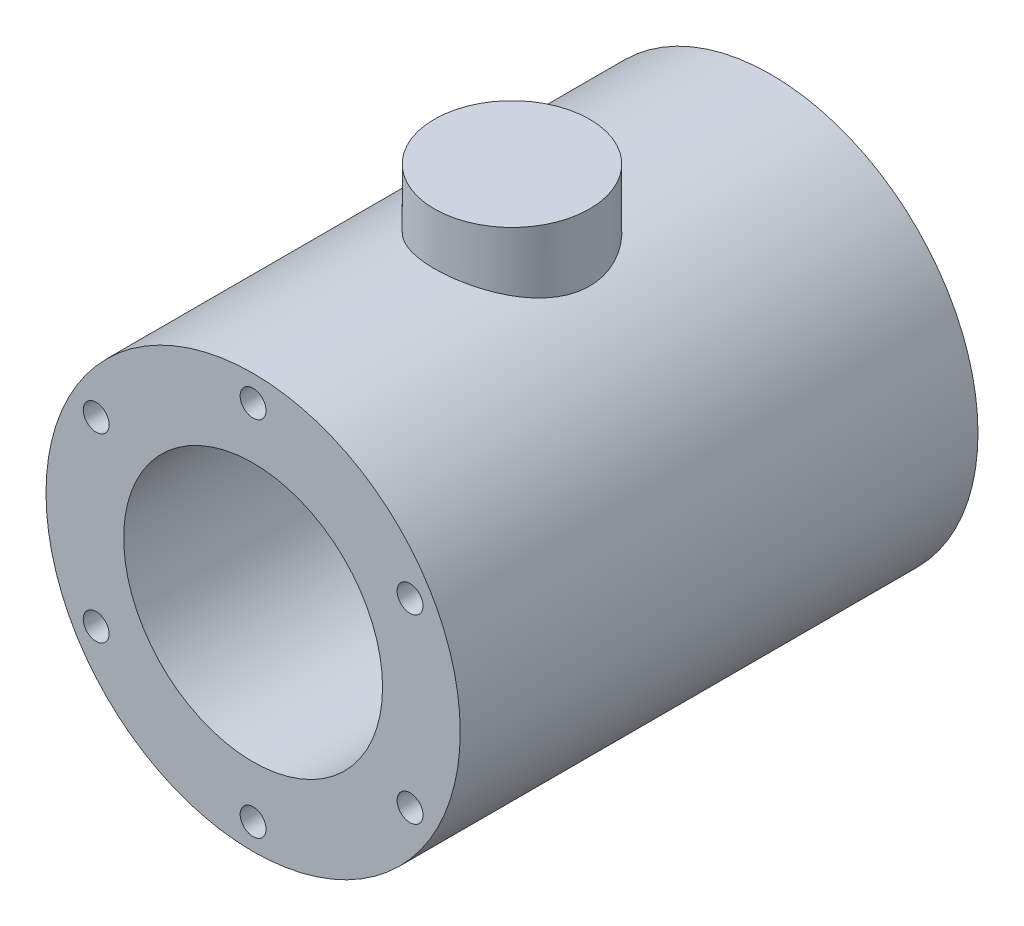
ISO-10303-21;
HEADER;
FILE_DESCRIPTION(('STEP AP214'),'2;1');
FILE_NAME('part.step','',(''),(''),'','','');
FILE_SCHEMA(('AUTOMOTIVE_DESIGN { 1 0 10303 214 1 1 1 1 }'));
ENDSEC;
DATA;
#1=APPLICATION_CONTEXT('core data for automotive mechanical design processes');
#2=APPLICATION_PROTOCOL_DEFINITION('international standard','automotive_design',2000,#1);
#3=PRODUCT_CONTEXT('',#1,'mechanical');
#4=PRODUCT('Part','Part','',(#3));
#5=PRODUCT_RELATED_PRODUCT_CATEGORY('part','',(#4));
#6=PRODUCT_DEFINITION_FORMATION('','',#4);
#7=PRODUCT_DEFINITION_CONTEXT('part definition',#1,'design');
#8=PRODUCT_DEFINITION('design','',#6,#7);
#9=PRODUCT_DEFINITION_SHAPE('','',#8);
#10=(LENGTH_UNIT() NAMED_UNIT(*) SI_UNIT(.MILLI.,.METRE.));
#11=(NAMED_UNIT(*) PLANE_ANGLE_UNIT() SI_UNIT($,.RADIAN.));
#12=(NAMED_UNIT(*) SI_UNIT($,.STERADIAN.) SOLID_ANGLE_UNIT());
#13=UNCERTAINTY_MEASURE_WITH_UNIT(LENGTH_MEASURE(1.E-05),#10,'distance_accuracy_value','');
#14=(GEOMETRIC_REPRESENTATION_CONTEXT(3) GLOBAL_UNCERTAINTY_ASSIGNED_CONTEXT((#13)) GLOBAL_UNIT_ASSIGNED_CONTEXT((#10,
#11,#12)) REPRESENTATION_CONTEXT('',''));
#15=CARTESIAN_POINT('',(0.,0.,0.));
#16=DIRECTION('',(0.,0.,1.));
#17=DIRECTION('',(1.,0.,0.));
#18=AXIS2_PLACEMENT_3D('',#15,#16,#17);
#19=CARTESIAN_POINT('',(0.,0.,100.));
#20=DIRECTION('',(0.,0.,-1.));
#21=DIRECTION('',(-1.,0.,0.));
#22=AXIS2_PLACEMENT_3D('',#19,#20,#21);
#23=CYLINDRICAL_SURFACE('',#22,40.);
#24=CARTESIAN_POINT('',(0.,0.,100.));
#25=DIRECTION('',(0.,0.,1.));
#26=DIRECTION('',(1.,0.,0.));
#27=AXIS2_PLACEMENT_3D('',#24,#25,#26);
#28=CIRCLE('',#27,40.);
#29=CARTESIAN_POINT('',(40.,0.,100.));
#30=VERTEX_POINT('',#29);
#31=EDGE_CURVE('E49',#30,#30,#28,.T.);
#32=ORIENTED_EDGE('',*,*,#31,.F.);
#33=EDGE_LOOP('',(#32));
#34=FACE_BOUND('',#33,.T.);
#35=CARTESIAN_POINT('',(0.,0.,0.));
#36=DIRECTION('',(0.,0.,1.));
#37=DIRECTION('',(1.,0.,0.));
#38=AXIS2_PLACEMENT_3D('',#35,#36,#37);
#39=CIRCLE('',#38,40.);
#40=CARTESIAN_POINT('',(40.,0.,0.));
#41=VERTEX_POINT('',#40);
#42=EDGE_CURVE('E54',#41,#41,#39,.T.);
#43=ORIENTED_EDGE('',*,*,#42,.T.);
#44=EDGE_LOOP('',(#43));
#45=FACE_BOUND('',#44,.T.);
#46=CARTESIAN_POINT('',(0.,40.,35.));
#47=CARTESIAN_POINT('',(-0.406155231941303,40.0000013887431,34.9999981078109));
#48=CARTESIAN_POINT('',(-0.812284348147754,39.9938006269278,35.0165087352432));
#49=CARTESIAN_POINT('',(-1.62147139095104,39.9691710100067,35.0823736768252));
#50=CARTESIAN_POINT('',(-2.02452957514366,39.950743192211,35.1317252048429));
#51=CARTESIAN_POINT('',(-2.82456330894158,39.9021609392328,35.262763514231));
#52=CARTESIAN_POINT('',(-3.22153975126587,39.8720082425855,35.3444455017548));
#53=CARTESIAN_POINT('',(-4.00666931290046,39.8007787911681,35.5393563651596));
#54=CARTESIAN_POINT('',(-4.39482219784621,39.759701746601,35.6525860779306));
#55=CARTESIAN_POINT('',(-5.15891467482712,39.6677879044666,35.9093037111225));
#56=CARTESIAN_POINT('',(-5.53487700582704,39.6169706650972,36.0527310509454));
#57=CARTESIAN_POINT('',(-6.27301569946845,39.5068163389401,36.3687688110822));
#58=CARTESIAN_POINT('',(-6.63519216809261,39.4474793176674,36.5413790069892));
#59=CARTESIAN_POINT('',(-7.34362780959021,39.3217570131001,36.914457942688));
#60=CARTESIAN_POINT('',(-7.6898863174579,39.2553714357202,37.1149278449718));
#61=CARTESIAN_POINT('',(-8.36464792699763,39.1171488135836,37.5423822776128));
#62=CARTESIAN_POINT('',(-8.69314455467263,39.0453098037457,37.769376381701));
#63=CARTESIAN_POINT('',(-9.34264058613321,38.8951200775698,38.2574993969521));
#64=CARTESIAN_POINT('',(-9.66287704281832,38.816625532978,38.5195995722186));
#65=CARTESIAN_POINT('',(-10.2803557268531,38.6576764432074,39.069075908794));
#66=CARTESIAN_POINT('',(-10.5775973290844,38.5772218448226,39.3564527567991));
#67=CARTESIAN_POINT('',(-11.1475099377515,38.4164124006621,39.9549099202484));
#68=CARTESIAN_POINT('',(-11.4201695058726,38.3360576183078,40.2660011472927));
#69=CARTESIAN_POINT('',(-11.9390379498077,38.1776498271183,40.909880624769));
#70=CARTESIAN_POINT('',(-12.1852557331364,38.0995960496066,41.2426615074592));
#71=CARTESIAN_POINT('',(-12.6586805831567,37.9449890154006,41.9413021187103));
#72=CARTESIAN_POINT('',(-12.8847959801516,37.8686081960777,42.3079410904324));
#73=CARTESIAN_POINT('',(-13.3051847550507,37.7229581925958,43.0604182261198));
#74=CARTESIAN_POINT('',(-13.4994571189537,37.6536892349313,43.4462570009689));
#75=CARTESIAN_POINT('',(-13.8544333470209,37.5245301930474,44.2344623219174));
#76=CARTESIAN_POINT('',(-14.015147681946,37.4646371848128,44.636823665621));
#77=CARTESIAN_POINT('',(-14.3015331739474,37.3562528480706,45.4553216064775));
#78=CARTESIAN_POINT('',(-14.4272063865916,37.3077608507878,45.8714573939968));
#79=CARTESIAN_POINT('',(-14.6377728200119,37.2256343859454,46.6970352812128));
#80=CARTESIAN_POINT('',(-14.7241266556605,37.1914723133209,47.1060523951637));
#81=CARTESIAN_POINT('',(-14.8624687487976,37.1364051781319,47.9307457779838));
#82=CARTESIAN_POINT('',(-14.914457888768,37.1154997751381,48.3464218755702));
#83=CARTESIAN_POINT('',(-14.9834733208266,37.0876922679378,49.180986486807));
#84=CARTESIAN_POINT('',(-15.00051204451,37.0807851846467,49.5998738050189));
#85=CARTESIAN_POINT('',(-14.9994645645736,37.0812091486228,50.4375889201603));
#86=CARTESIAN_POINT('',(-14.9813797233542,37.0885396436317,50.8564167187682));
#87=CARTESIAN_POINT('',(-14.9124348098487,37.1163110276097,51.6655821410388));
#88=CARTESIAN_POINT('',(-14.8636042471798,37.1359397477467,52.0561227078548));
#89=CARTESIAN_POINT('',(-14.7355873547809,37.1869225256987,52.8313977791823));
#90=CARTESIAN_POINT('',(-14.656402420588,37.2182760444665,53.2161325497691));
#91=CARTESIAN_POINT('',(-14.4684135891209,37.2917574570459,53.9772736256728));
#92=CARTESIAN_POINT('',(-14.3596065605833,37.3338864898767,54.3536790459679));
#93=CARTESIAN_POINT('',(-14.1133273980098,37.4276813895696,55.0957670642799));
#94=CARTESIAN_POINT('',(-13.9758543280917,37.4793475677919,55.4614493117645));
#95=CARTESIAN_POINT('',(-13.6705139760041,37.5918075323209,56.186656663562));
#96=CARTESIAN_POINT('',(-13.5021267029571,37.6527538500109,56.5459389956553));
#97=CARTESIAN_POINT('',(-13.1379428423647,37.7813677039867,57.2492302548566));
#98=CARTESIAN_POINT('',(-12.9421362090161,37.8490377010178,57.593233522958));
#99=CARTESIAN_POINT('',(-12.5244597645839,37.9892935671164,58.2640200072026));
#100=CARTESIAN_POINT('',(-12.3025873820878,38.0618799208878,58.5908015197881));
#101=CARTESIAN_POINT('',(-11.8341486565989,38.2101200096741,59.2254262908388));
#102=CARTESIAN_POINT('',(-11.5875811971466,38.2857738832788,59.5332686920539));
#103=CARTESIAN_POINT('',(-11.0537012467449,38.44344256231,60.1485258104847));
#104=CARTESIAN_POINT('',(-10.7647618949301,38.5255420356548,60.4545090845912));
#105=CARTESIAN_POINT('',(-10.1622074990615,38.688847504194,61.0411172613779));
#106=CARTESIAN_POINT('',(-9.84860247827213,38.7700538471901,61.3217523660818));
#107=CARTESIAN_POINT('',(-9.19826252614065,38.9294759681023,61.8561883007412));
#108=CARTESIAN_POINT('',(-8.86151413829134,39.007689964296,62.1099732974254));
#109=CARTESIAN_POINT('',(-8.1671901964737,39.1589476038946,62.5886750200747));
#110=CARTESIAN_POINT('',(-7.80962316257225,39.231993335683,62.8136034365821));
#111=CARTESIAN_POINT('',(-7.06994033251437,39.372069051516,63.2363223599273));
#112=CARTESIAN_POINT('',(-6.68752662946516,39.4389861908746,63.4336297440471));
#113=CARTESIAN_POINT('',(-5.9058869853156,39.5635829668856,63.7951405830679));
#114=CARTESIAN_POINT('',(-5.50666073576375,39.6212624339658,63.9593434302963));
#115=CARTESIAN_POINT('',(-4.69439988189091,39.7256868620305,64.2530361633294));
#116=CARTESIAN_POINT('',(-4.28137030067998,39.7724357522422,64.3825385254094));
#117=CARTESIAN_POINT('',(-3.44453132425186,39.8536306085204,64.6055701415171));
#118=CARTESIAN_POINT('',(-3.02072257585328,39.8880773109393,64.6991015486268));
#119=CARTESIAN_POINT('',(-2.18849551644941,39.9421460522351,64.8451800918348));
#120=CARTESIAN_POINT('',(-1.78045741668368,39.962459083635,64.8996423544147));
#121=CARTESIAN_POINT('',(-0.960859723782183,39.990559498139,64.9748481071268));
#122=CARTESIAN_POINT('',(-0.549300256077096,39.9983473255374,64.9955927932897));
#123=CARTESIAN_POINT('',(0.274091236191259,40.0011792980538,65.0031448468052));
#124=CARTESIAN_POINT('',(0.685923192079357,39.9962259242751,64.9899588215095));
#125=CARTESIAN_POINT('',(1.50675968753968,39.9737193163572,64.9298029053099));
#126=CARTESIAN_POINT('',(1.91576427005508,39.9561662740128,64.8828335286632));
#127=CARTESIAN_POINT('',(2.71219474626321,39.9098605286727,64.7580545154331));
#128=CARTESIAN_POINT('',(3.09984517091598,39.8815650325298,64.6815018544886));
#129=CARTESIAN_POINT('',(3.86703155017864,39.8144990406299,64.4983307144838));
#130=CARTESIAN_POINT('',(4.24656776694291,39.7757288838425,64.3917132083446));
#131=CARTESIAN_POINT('',(4.99511663749268,39.6886736461039,64.1493321365659));
#132=CARTESIAN_POINT('',(5.36412841855628,39.6403877786885,64.0135661617513));
#133=CARTESIAN_POINT('',(6.08935991488233,39.535477262355,63.7139942249234));
#134=CARTESIAN_POINT('',(6.44557921228686,39.4788523413548,63.5501873479789));
#135=CARTESIAN_POINT('',(7.1534241639373,39.3568452542714,63.1905538364841));
#136=CARTESIAN_POINT('',(7.50460797444908,39.2912548058819,62.9939283840587));
#137=CARTESIAN_POINT('',(8.18924056088557,39.1542875668433,62.5736901626576));
#138=CARTESIAN_POINT('',(8.52268909183351,39.0829106963008,62.3500770210413));
#139=CARTESIAN_POINT('',(9.17007857656461,38.9360996297209,61.8773036099785));
#140=CARTESIAN_POINT('',(9.48401656566,38.8606648203,61.6281394731482));
#141=CARTESIAN_POINT('',(10.0907594848575,38.7075512388676,61.1057150746496));
#142=CARTESIAN_POINT('',(10.3835568271633,38.6298716750388,60.8324462387436));
#143=CARTESIAN_POINT('',(10.9626367898233,38.4696763411679,60.2469406946293));
#144=CARTESIAN_POINT('',(11.2475607613895,38.3871409551206,59.9333638794129));
#145=CARTESIAN_POINT('',(11.790108036202,38.2239928073906,59.2829265111291));
#146=CARTESIAN_POINT('',(12.0477298744787,38.1433801490565,58.9460647102438));
#147=CARTESIAN_POINT('',(12.5340206849557,37.9863613419296,58.2509565273495));
#148=CARTESIAN_POINT('',(12.7626808458368,37.9099564772955,57.8927036858622));
#149=CARTESIAN_POINT('',(13.189195002037,37.7636858295333,57.1572179090211));
#150=CARTESIAN_POINT('',(13.3870613549922,37.6938174278185,56.7799926681732));
#151=CARTESIAN_POINT('',(13.7512889130172,37.5624776292405,56.007108182418));
#152=CARTESIAN_POINT('',(13.9175068446813,37.501044754149,55.611374758442));
#153=CARTESIAN_POINT('',(14.2158139686818,37.3889830200381,54.80573904588));
#154=CARTESIAN_POINT('',(14.3479028565703,37.3383542573976,54.3958366309365));
#155=CARTESIAN_POINT('',(14.5765364210781,37.2496931258823,53.5651188727918));
#156=CARTESIAN_POINT('',(14.6730994876903,37.2116542408657,53.1443092968077));
#157=CARTESIAN_POINT('',(14.8296900889223,37.1495278854578,52.2949376366465));
#158=CARTESIAN_POINT('',(14.8897201716976,37.1254394420366,51.8663760953122));
#159=CARTESIAN_POINT('',(14.9698774840286,37.0931865199997,51.0327957129456));
#160=CARTESIAN_POINT('',(14.9923210727599,37.0840982023262,50.6280337827139));
#161=CARTESIAN_POINT('',(15.0043637110964,37.0792276534441,49.8179504991344));
#162=CARTESIAN_POINT('',(14.9939642311019,37.0834448265423,49.4126291716433));
#163=CARTESIAN_POINT('',(14.9404378514227,37.1050419619324,48.6045516330812));
#164=CARTESIAN_POINT('',(14.8973139414604,37.1224207217741,48.2017951910701));
#165=CARTESIAN_POINT('',(14.7788002566835,37.1697608730416,47.4018146876179));
#166=CARTESIAN_POINT('',(14.7034105043358,37.199722255706,47.0045906223248));
#167=CARTESIAN_POINT('',(14.5239224261862,37.270157700168,46.2305619283424));
#168=CARTESIAN_POINT('',(14.4207734812718,37.3102819057482,45.8535044454488));
#169=CARTESIAN_POINT('',(14.1857898073017,37.4002564193183,45.1096522552154));
#170=CARTESIAN_POINT('',(14.0539558787024,37.4501064559041,44.7428572618222));
#171=CARTESIAN_POINT('',(13.7626630336337,37.558131175397,44.0216760237291));
#172=CARTESIAN_POINT('',(13.6032033075099,37.6163061022804,43.6672901430803));
#173=CARTESIAN_POINT('',(13.2577706379718,37.7394373994892,42.9727667908268));
#174=CARTESIAN_POINT('',(13.0717881001393,37.804396221549,42.6326345332187));
#175=CARTESIAN_POINT('',(12.6641940148662,37.9429426303286,41.9511521579179));
#176=CARTESIAN_POINT('',(12.4412285835312,38.0168037297325,41.610667014995));
#177=CARTESIAN_POINT('',(11.9688197830464,38.1681655144786,40.9494494205335));
#178=CARTESIAN_POINT('',(11.7193755752939,38.2456663150497,40.628717595106));
#179=CARTESIAN_POINT('',(11.1954065584279,38.4023131740955,40.0086183373356));
#180=CARTESIAN_POINT('',(10.9208706472744,38.4814599487649,39.7092604674464));
#181=CARTESIAN_POINT('',(10.348471530804,38.6393224858588,39.1338237997934));
#182=CARTESIAN_POINT('',(10.0506156438929,38.718038375275,38.8577377547688));
#183=CARTESIAN_POINT('',(9.41632697024718,38.8773122669273,38.3159916143165));
#184=CARTESIAN_POINT('',(9.0786771669714,38.9577376446488,38.051715047067));
#185=CARTESIAN_POINT('',(8.38122903939964,39.113714726014,37.5525542759276));
#186=CARTESIAN_POINT('',(8.02143011187375,39.1892662968051,37.3176708730874));
#187=CARTESIAN_POINT('',(7.28190441958342,39.3333925489983,36.8790744442131));
#188=CARTESIAN_POINT('',(6.90217541271582,39.4019664428614,36.6753649353314));
#189=CARTESIAN_POINT('',(6.12534658267168,39.5301795476008,36.3008738412608));
#190=CARTESIAN_POINT('',(5.72824648327021,39.589818616334,36.1300927799144));
#191=CARTESIAN_POINT('',(4.90189687575751,39.7007883981909,35.816379769913));
#192=CARTESIAN_POINT('',(4.47200013929826,39.7516456511957,35.6749798696828));
#193=CARTESIAN_POINT('',(3.59988024064193,39.8400922813996,35.4313400751276));
#194=CARTESIAN_POINT('',(3.15765646099725,39.8776809926994,35.329102146176));
#195=CARTESIAN_POINT('',(2.26497493801951,39.9383266044978,35.1650498106056));
#196=CARTESIAN_POINT('',(1.81452074029841,39.9613896174616,35.1032184003688));
#197=CARTESIAN_POINT('',(0.909366462952382,39.9922246755778,35.0206968743081));
#198=CARTESIAN_POINT('',(0.454666868030222,39.9999984453838,35.0000021181943));
#199=CARTESIAN_POINT('',(0.,40.,35.));
#200=B_SPLINE_CURVE_WITH_KNOTS('',3,(#46,#47,#48,#49,#50,#51,#52,#53,#54,#55,#56,#57,#58,#59,
#60,#61,#62,#63,#64,#65,#66,#67,#68,#69,#70,#71,#72,#73,#74,#75,#76,#77,#78,#79,#80,#81,#82,#83,
#84,#85,#86,#87,#88,#89,#90,#91,#92,#93,#94,#95,#96,#97,#98,#99,#100,#101,#102,#103,#104,#105,
#106,#107,#108,#109,#110,#111,#112,#113,#114,#115,#116,#117,#118,#119,#120,#121,#122,#123,#124,
#125,#126,#127,#128,#129,#130,#131,#132,#133,#134,#135,#136,#137,#138,#139,#140,#141,#142,#143,
#144,#145,#146,#147,#148,#149,#150,#151,#152,#153,#154,#155,#156,#157,#158,#159,#160,#161,#162,
#163,#164,#165,#166,#167,#168,#169,#170,#171,#172,#173,#174,#175,#176,#177,#178,#179,#180,#181,
#182,#183,#184,#185,#186,#187,#188,#189,#190,#191,#192,#193,#194,#195,#196,#197,#198,#199),
.UNSPECIFIED.,.T.,.F.,(4,2,2,2,2,2,2,2,2,2,2,2,2,2,2,2,2,2,2,2,2,2,2,2,2,2,2,2,2,2,2,2,2,2,2,2,
2,2,2,2,2,2,2,2,2,2,2,2,2,2,2,2,2,2,2,2,2,2,2,2,2,2,2,2,2,2,2,2,2,2,2,2,2,2,2,2,4),(0.,
1.21803976956057,2.43597621713674,3.65373214099881,4.87152037225308,6.08688844231483,
7.30224716700768,8.51765661977119,9.73350612938794,10.9956964679824,12.2579211073466,
13.5207300759098,14.7831122953106,16.0939232170195,17.4047758717499,18.7152189016251,
20.0255850426486,21.2822308209684,22.538844327505,23.7950107886898,25.0511285256742,
26.2319550333797,27.412727259297,28.5936243496273,29.7745599996476,30.9775647468564,
32.1810114052859,33.3845768847911,34.5881968018334,35.8730601315619,37.157404008973,
38.4425010801098,39.7270758702025,41.0318791223794,42.3367063235757,43.6410637534126,
44.9453430973125,46.180256651397,47.4151263996391,48.6497556990084,49.8843662049953,
51.071444017575,52.2584834198288,53.4456209708951,54.6327972638094,55.8548248603576,
57.0768693323477,58.2990990460617,59.5217652836715,60.8152199534079,62.1087439918366,
63.402660632329,64.6960566742373,65.9951755572421,67.2943060286288,68.5927630538542,
69.8911295020355,71.1060594166908,72.3209349391056,73.5356994831677,74.750463181382,
75.9280439339243,77.1055918302024,78.2831742437825,79.4611837241906,80.7007450797818,
81.9403457049348,83.1804974820594,84.4202616159006,85.7274480366865,87.0346700743707,
88.3420394890538,89.6494297003216,91.0136133518111,92.3778654569305,93.7415430957105,
95.1050669004276),.UNSPECIFIED.);
#201=CARTESIAN_POINT('',(0.,40.,35.));
#202=VERTEX_POINT('',#201);
#203=EDGE_CURVE('E10',#202,#202,#200,.T.);
#204=ORIENTED_EDGE('',*,*,#203,.F.);
#205=EDGE_LOOP('',(#204));
#206=FACE_BOUND('',#205,.T.);
#207=ADVANCED_FACE('F37',(#34,#45,#206),#23,.T.);
#208=CARTESIAN_POINT('',(0.,0.,100.));
#209=DIRECTION('',(0.,0.,1.));
#210=DIRECTION('',(1.,0.,0.));
#211=AXIS2_PLACEMENT_3D('',#208,#209,#210);
#212=PLANE('',#211);
#213=CARTESIAN_POINT('',(0.,35.,100.));
#214=DIRECTION('',(0.,0.,-1.));
#215=DIRECTION('',(-1.,0.,0.));
#216=AXIS2_PLACEMENT_3D('',#213,#214,#215);
#217=CIRCLE('',#216,2.5);
#218=CARTESIAN_POINT('',(-2.5,35.,100.));
#219=VERTEX_POINT('',#218);
#220=EDGE_CURVE('E85',#219,#219,#217,.T.);
#221=ORIENTED_EDGE('',*,*,#220,.T.);
#222=EDGE_LOOP('',(#221));
#223=FACE_BOUND('',#222,.T.);
#224=CARTESIAN_POINT('',(30.3108891324554,17.5,100.));
#225=DIRECTION('',(0.,0.,-1.));
#226=DIRECTION('',(-1.,0.,0.));
#227=AXIS2_PLACEMENT_3D('',#224,#225,#226);
#228=CIRCLE('',#227,2.5);
#229=CARTESIAN_POINT('',(27.8108891324554,17.5,100.));
#230=VERTEX_POINT('',#229);
#231=EDGE_CURVE('E91',#230,#230,#228,.T.);
#232=ORIENTED_EDGE('',*,*,#231,.T.);
#233=EDGE_LOOP('',(#232));
#234=FACE_BOUND('',#233,.T.);
#235=CARTESIAN_POINT('',(30.3108891324554,-17.5,100.));
#236=DIRECTION('',(0.,0.,-1.));
#237=DIRECTION('',(-1.,0.,0.));
#238=AXIS2_PLACEMENT_3D('',#235,#236,#237);
#239=CIRCLE('',#238,2.5);
#240=CARTESIAN_POINT('',(27.8108891324553,-17.5,100.));
#241=VERTEX_POINT('',#240);
#242=EDGE_CURVE('E90',#241,#241,#239,.T.);
#243=ORIENTED_EDGE('',*,*,#242,.T.);
#244=EDGE_LOOP('',(#243));
#245=FACE_BOUND('',#244,.T.);
#246=CARTESIAN_POINT('',(0.,-35.,100.));
#247=DIRECTION('',(0.,0.,-1.));
#248=DIRECTION('',(-1.,0.,0.));
#249=AXIS2_PLACEMENT_3D('',#246,#247,#248);
#250=CIRCLE('',#249,2.5);
#251=CARTESIAN_POINT('',(-2.50000000000001,-35.,100.));
#252=VERTEX_POINT('',#251);
#253=EDGE_CURVE('E99',#252,#252,#250,.T.);
#254=ORIENTED_EDGE('',*,*,#253,.T.);
#255=EDGE_LOOP('',(#254));
#256=FACE_BOUND('',#255,.T.);
#257=CARTESIAN_POINT('',(-30.3108891324554,-17.5,100.));
#258=DIRECTION('',(0.,0.,-1.));
#259=DIRECTION('',(-1.,0.,0.));
#260=AXIS2_PLACEMENT_3D('',#257,#258,#259);
#261=CIRCLE('',#260,2.50000000000001);
#262=CARTESIAN_POINT('',(-32.8108891324554,-17.5,100.));
#263=VERTEX_POINT('',#262);
#264=EDGE_CURVE('E107',#263,#263,#261,.T.);
#265=ORIENTED_EDGE('',*,*,#264,.T.);
#266=EDGE_LOOP('',(#265));
#267=FACE_BOUND('',#266,.T.);
#268=CARTESIAN_POINT('',(-30.3108891324554,17.5,100.));
#269=DIRECTION('',(0.,0.,-1.));
#270=DIRECTION('',(-1.,0.,0.));
#271=AXIS2_PLACEMENT_3D('',#268,#269,#270);
#272=CIRCLE('',#271,2.50000000000001);
#273=CARTESIAN_POINT('',(-32.8108891324554,17.5,100.));
#274=VERTEX_POINT('',#273);
#275=EDGE_CURVE('E115',#274,#274,#272,.T.);
#276=ORIENTED_EDGE('',*,*,#275,.T.);
#277=EDGE_LOOP('',(#276));
#278=FACE_BOUND('',#277,.T.);
#279=CARTESIAN_POINT('',(0.,0.,100.));
#280=DIRECTION('',(0.,0.,1.));
#281=DIRECTION('',(1.,0.,0.));
#282=AXIS2_PLACEMENT_3D('',#279,#280,#281);
#283=CIRCLE('',#282,25.);
#284=CARTESIAN_POINT('',(25.,0.,100.));
#285=VERTEX_POINT('',#284);
#286=EDGE_CURVE('E60',#285,#285,#283,.F.);
#287=ORIENTED_EDGE('',*,*,#286,.T.);
#288=EDGE_LOOP('',(#287));
#289=FACE_BOUND('',#288,.T.);
#290=ORIENTED_EDGE('',*,*,#31,.T.);
#291=EDGE_LOOP('',(#290));
#292=FACE_BOUND('',#291,.T.);
#293=ADVANCED_FACE('F134',(#223,#234,#245,#256,#267,#278,#289,#292),#212,.T.);
#294=CARTESIAN_POINT('',(0.,0.,0.));
#295=DIRECTION('',(0.,0.,1.));
#296=DIRECTION('',(1.,0.,0.));
#297=AXIS2_PLACEMENT_3D('',#294,#295,#296);
#298=PLANE('',#297);
#299=CARTESIAN_POINT('',(0.,35.,0.));
#300=DIRECTION('',(0.,0.,-1.));
#301=DIRECTION('',(-1.,0.,0.));
#302=AXIS2_PLACEMENT_3D('',#299,#300,#301);
#303=CIRCLE('',#302,2.5);
#304=CARTESIAN_POINT('',(-2.5,35.,0.));
#305=VERTEX_POINT('',#304);
#306=EDGE_CURVE('E119',#305,#305,#303,.T.);
#307=ORIENTED_EDGE('',*,*,#306,.F.);
#308=EDGE_LOOP('',(#307));
#309=FACE_BOUND('',#308,.T.);
#310=CARTESIAN_POINT('',(30.3108891324554,17.5,0.));
#311=DIRECTION('',(0.,0.,-1.));
#312=DIRECTION('',(-1.,0.,0.));
#313=AXIS2_PLACEMENT_3D('',#310,#311,#312);
#314=CIRCLE('',#313,2.5);
#315=CARTESIAN_POINT('',(27.8108891324554,17.5,0.));
#316=VERTEX_POINT('',#315);
#317=EDGE_CURVE('E120',#316,#316,#314,.T.);
#318=ORIENTED_EDGE('',*,*,#317,.F.);
#319=EDGE_LOOP('',(#318));
#320=FACE_BOUND('',#319,.T.);
#321=CARTESIAN_POINT('',(30.3108891324554,-17.5,0.));
#322=DIRECTION('',(0.,0.,-1.));
#323=DIRECTION('',(-1.,0.,0.));
#324=AXIS2_PLACEMENT_3D('',#321,#322,#323);
#325=CIRCLE('',#324,2.5);
#326=CARTESIAN_POINT('',(27.8108891324553,-17.5,0.));
#327=VERTEX_POINT('',#326);
#328=EDGE_CURVE('E86',#327,#327,#325,.T.);
#329=ORIENTED_EDGE('',*,*,#328,.F.);
#330=EDGE_LOOP('',(#329));
#331=FACE_BOUND('',#330,.T.);
#332=CARTESIAN_POINT('',(0.,-35.,0.));
#333=DIRECTION('',(0.,0.,-1.));
#334=DIRECTION('',(-1.,0.,0.));
#335=AXIS2_PLACEMENT_3D('',#332,#333,#334);
#336=CIRCLE('',#335,2.5);
#337=CARTESIAN_POINT('',(-2.50000000000001,-35.,0.));
#338=VERTEX_POINT('',#337);
#339=EDGE_CURVE('E95',#338,#338,#336,.T.);
#340=ORIENTED_EDGE('',*,*,#339,.F.);
#341=EDGE_LOOP('',(#340));
#342=FACE_BOUND('',#341,.T.);
#343=CARTESIAN_POINT('',(-30.3108891324554,-17.5,0.));
#344=DIRECTION('',(0.,0.,-1.));
#345=DIRECTION('',(-1.,0.,0.));
#346=AXIS2_PLACEMENT_3D('',#343,#344,#345);
#347=CIRCLE('',#346,2.50000000000001);
#348=CARTESIAN_POINT('',(-32.8108891324554,-17.5,0.));
#349=VERTEX_POINT('',#348);
#350=EDGE_CURVE('E103',#349,#349,#347,.T.);
#351=ORIENTED_EDGE('',*,*,#350,.F.);
#352=EDGE_LOOP('',(#351));
#353=FACE_BOUND('',#352,.T.);
#354=CARTESIAN_POINT('',(-30.3108891324554,17.5,0.));
#355=DIRECTION('',(0.,0.,-1.));
#356=DIRECTION('',(-1.,0.,0.));
#357=AXIS2_PLACEMENT_3D('',#354,#355,#356);
#358=CIRCLE('',#357,2.50000000000001);
#359=CARTESIAN_POINT('',(-32.8108891324554,17.5,0.));
#360=VERTEX_POINT('',#359);
#361=EDGE_CURVE('E111',#360,#360,#358,.T.);
#362=ORIENTED_EDGE('',*,*,#361,.F.);
#363=EDGE_LOOP('',(#362));
#364=FACE_BOUND('',#363,.T.);
#365=CARTESIAN_POINT('',(0.,0.,0.));
#366=DIRECTION('',(0.,0.,1.));
#367=DIRECTION('',(1.,0.,0.));
#368=AXIS2_PLACEMENT_3D('',#365,#366,#367);
#369=CIRCLE('',#368,30.);
#370=CARTESIAN_POINT('',(30.,0.,0.));
#371=VERTEX_POINT('',#370);
#372=EDGE_CURVE('E74',#371,#371,#369,.T.);
#373=ORIENTED_EDGE('',*,*,#372,.T.);
#374=EDGE_LOOP('',(#373));
#375=FACE_BOUND('',#374,.T.);
#376=ORIENTED_EDGE('',*,*,#42,.F.);
#377=EDGE_LOOP('',(#376));
#378=FACE_BOUND('',#377,.T.);
#379=ADVANCED_FACE('F144',(#309,#320,#331,#342,#353,#364,#375,#378),#298,.F.);
#380=CARTESIAN_POINT('',(0.,0.,246.));
#381=DIRECTION('',(0.,0.,-1.));
#382=DIRECTION('',(-1.,0.,0.));
#383=AXIS2_PLACEMENT_3D('',#380,#381,#382);
#384=CYLINDRICAL_SURFACE('',#383,25.);
#385=CARTESIAN_POINT('',(0.,0.,7.50000000000001));
#386=DIRECTION('',(0.,0.,1.));
#387=DIRECTION('',(1.,0.,0.));
#388=AXIS2_PLACEMENT_3D('',#385,#386,#387);
#389=CIRCLE('',#388,25.);
#390=CARTESIAN_POINT('',(25.,0.,7.50000000000001));
#391=VERTEX_POINT('',#390);
#392=EDGE_CURVE('E64',#391,#391,#389,.T.);
#393=ORIENTED_EDGE('',*,*,#392,.F.);
#394=EDGE_LOOP('',(#393));
#395=FACE_BOUND('',#394,.T.);
#396=ORIENTED_EDGE('',*,*,#286,.F.);
#397=EDGE_LOOP('',(#396));
#398=FACE_BOUND('',#397,.T.);
#399=ADVANCED_FACE('F147',(#395,#398),#384,.F.);
#400=CARTESIAN_POINT('',(0.,0.,7.5));
#401=DIRECTION('',(0.,0.,-1.));
#402=DIRECTION('',(-1.,0.,0.));
#403=AXIS2_PLACEMENT_3D('',#400,#401,#402);
#404=CYLINDRICAL_SURFACE('',#403,30.);
#405=CARTESIAN_POINT('',(0.,0.,7.5));
#406=DIRECTION('',(0.,0.,1.));
#407=DIRECTION('',(1.,0.,0.));
#408=AXIS2_PLACEMENT_3D('',#405,#406,#407);
#409=CIRCLE('',#408,30.);
#410=CARTESIAN_POINT('',(30.,0.,7.5));
#411=VERTEX_POINT('',#410);
#412=EDGE_CURVE('E67',#411,#411,#409,.T.);
#413=ORIENTED_EDGE('',*,*,#412,.T.);
#414=EDGE_LOOP('',(#413));
#415=FACE_BOUND('',#414,.T.);
#416=ORIENTED_EDGE('',*,*,#372,.F.);
#417=EDGE_LOOP('',(#416));
#418=FACE_BOUND('',#417,.T.);
#419=ADVANCED_FACE('F174',(#415,#418),#404,.F.);
#420=CARTESIAN_POINT('',(0.,0.,7.5));
#421=DIRECTION('',(0.,0.,1.));
#422=DIRECTION('',(1.,0.,0.));
#423=AXIS2_PLACEMENT_3D('',#420,#421,#422);
#424=PLANE('',#423);
#425=ORIENTED_EDGE('',*,*,#392,.T.);
#426=EDGE_LOOP('',(#425));
#427=FACE_BOUND('',#426,.T.);
#428=ORIENTED_EDGE('',*,*,#412,.F.);
#429=EDGE_LOOP('',(#428));
#430=FACE_BOUND('',#429,.T.);
#431=ADVANCED_FACE('F178',(#427,#430),#424,.F.);
#432=CARTESIAN_POINT('',(0.,50.,50.));
#433=DIRECTION('',(0.,-1.,0.));
#434=DIRECTION('',(0.,0.,-1.));
#435=AXIS2_PLACEMENT_3D('',#432,#433,#434);
#436=CYLINDRICAL_SURFACE('',#435,15.);
#437=CARTESIAN_POINT('',(0.,50.,50.));
#438=DIRECTION('',(0.,1.,0.));
#439=DIRECTION('',(0.,0.,1.));
#440=AXIS2_PLACEMENT_3D('',#437,#438,#439);
#441=CIRCLE('',#440,15.);
#442=CARTESIAN_POINT('',(0.,50.,65.));
#443=VERTEX_POINT('',#442);
#444=EDGE_CURVE('E80',#443,#443,#441,.T.);
#445=ORIENTED_EDGE('',*,*,#444,.F.);
#446=EDGE_LOOP('',(#445));
#447=FACE_BOUND('',#446,.T.);
#448=ORIENTED_EDGE('',*,*,#203,.T.);
#449=EDGE_LOOP('',(#448));
#450=FACE_BOUND('',#449,.T.);
#451=ADVANCED_FACE('F180',(#447,#450),#436,.T.);
#452=CARTESIAN_POINT('',(0.,50.,50.));
#453=DIRECTION('',(0.,1.,0.));
#454=DIRECTION('',(0.,0.,1.));
#455=AXIS2_PLACEMENT_3D('',#452,#453,#454);
#456=PLANE('',#455);
#457=ORIENTED_EDGE('',*,*,#444,.T.);
#458=EDGE_LOOP('',(#457));
#459=FACE_BOUND('',#458,.T.);
#460=ADVANCED_FACE('F184',(#459),#456,.T.);
#461=CARTESIAN_POINT('',(-30.3108891324554,17.5,100.));
#462=DIRECTION('',(0.,0.,-1.));
#463=DIRECTION('',(-1.,0.,0.));
#464=AXIS2_PLACEMENT_3D('',#461,#462,#463);
#465=CYLINDRICAL_SURFACE('',#464,2.50000000000001);
#466=ORIENTED_EDGE('',*,*,#275,.F.);
#467=EDGE_LOOP('',(#466));
#468=FACE_BOUND('',#467,.T.);
#469=ORIENTED_EDGE('',*,*,#361,.T.);
#470=EDGE_LOOP('',(#469));
#471=FACE_BOUND('',#470,.T.);
#472=ADVANCED_FACE('F188',(#468,#471),#465,.F.);
#473=CARTESIAN_POINT('',(-30.3108891324554,-17.5,100.));
#474=DIRECTION('',(0.,0.,-1.));
#475=DIRECTION('',(-1.,0.,0.));
#476=AXIS2_PLACEMENT_3D('',#473,#474,#475);
#477=CYLINDRICAL_SURFACE('',#476,2.50000000000001);
#478=ORIENTED_EDGE('',*,*,#264,.F.);
#479=EDGE_LOOP('',(#478));
#480=FACE_BOUND('',#479,.T.);
#481=ORIENTED_EDGE('',*,*,#350,.T.);
#482=EDGE_LOOP('',(#481));
#483=FACE_BOUND('',#482,.T.);
#484=ADVANCED_FACE('F197',(#480,#483),#477,.F.);
#485=CARTESIAN_POINT('',(0.,-35.,100.));
#486=DIRECTION('',(0.,0.,-1.));
#487=DIRECTION('',(-1.,0.,0.));
#488=AXIS2_PLACEMENT_3D('',#485,#486,#487);
#489=CYLINDRICAL_SURFACE('',#488,2.5);
#490=ORIENTED_EDGE('',*,*,#253,.F.);
#491=EDGE_LOOP('',(#490));
#492=FACE_BOUND('',#491,.T.);
#493=ORIENTED_EDGE('',*,*,#339,.T.);
#494=EDGE_LOOP('',(#493));
#495=FACE_BOUND('',#494,.T.);
#496=ADVANCED_FACE('F193',(#492,#495),#489,.F.);
#497=CARTESIAN_POINT('',(30.3108891324554,-17.5,100.));
#498=DIRECTION('',(0.,0.,-1.));
#499=DIRECTION('',(-1.,0.,0.));
#500=AXIS2_PLACEMENT_3D('',#497,#498,#499);
#501=CYLINDRICAL_SURFACE('',#500,2.5);
#502=ORIENTED_EDGE('',*,*,#242,.F.);
#503=EDGE_LOOP('',(#502));
#504=FACE_BOUND('',#503,.T.);
#505=ORIENTED_EDGE('',*,*,#328,.T.);
#506=EDGE_LOOP('',(#505));
#507=FACE_BOUND('',#506,.T.);
#508=ADVANCED_FACE('F190',(#504,#507),#501,.F.);
#509=CARTESIAN_POINT('',(30.3108891324554,17.5,100.));
#510=DIRECTION('',(0.,0.,-1.));
#511=DIRECTION('',(-1.,0.,0.));
#512=AXIS2_PLACEMENT_3D('',#509,#510,#511);
#513=CYLINDRICAL_SURFACE('',#512,2.5);
#514=ORIENTED_EDGE('',*,*,#231,.F.);
#515=EDGE_LOOP('',(#514));
#516=FACE_BOUND('',#515,.T.);
#517=ORIENTED_EDGE('',*,*,#317,.T.);
#518=EDGE_LOOP('',(#517));
#519=FACE_BOUND('',#518,.T.);
#520=ADVANCED_FACE('F140',(#516,#519),#513,.F.);
#521=CARTESIAN_POINT('',(0.,35.,100.));
#522=DIRECTION('',(0.,0.,-1.));
#523=DIRECTION('',(-1.,0.,0.));
#524=AXIS2_PLACEMENT_3D('',#521,#522,#523);
#525=CYLINDRICAL_SURFACE('',#524,2.5);
#526=ORIENTED_EDGE('',*,*,#220,.F.);
#527=EDGE_LOOP('',(#526));
#528=FACE_BOUND('',#527,.T.);
#529=ORIENTED_EDGE('',*,*,#306,.T.);
#530=EDGE_LOOP('',(#529));
#531=FACE_BOUND('',#530,.T.);
#532=ADVANCED_FACE('F137',(#528,#531),#525,.F.);
#533=CLOSED_SHELL('',(#207,#293,#379,#399,#419,#431,#451,#460,#472,#484,#496,#508,#520,#532));
#534=MANIFOLD_SOLID_BREP('B2',#533);
#535=ADVANCED_BREP_SHAPE_REPRESENTATION('',(#18,#534),#14);
#536=SHAPE_DEFINITION_REPRESENTATION(#9,#535);
ENDSEC;
END-ISO-10303-21;
